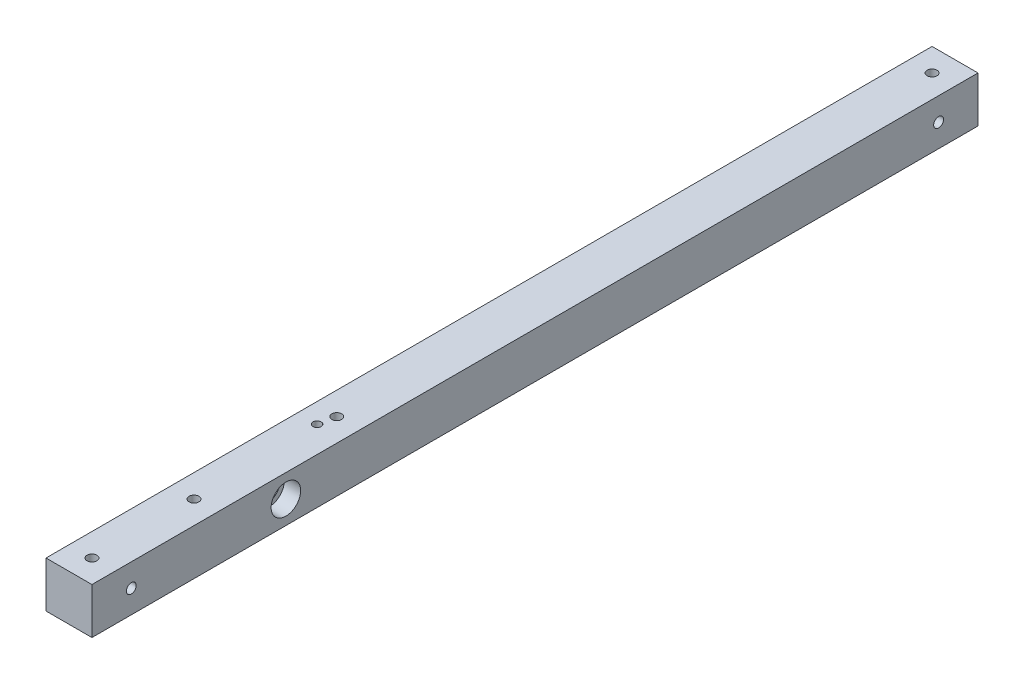
ISO-10303-21;
HEADER;
FILE_DESCRIPTION(('STEP AP214'),'2;1');
FILE_NAME('part.step','',(''),(''),'','','');
FILE_SCHEMA(('AUTOMOTIVE_DESIGN { 1 0 10303 214 1 1 1 1 }'));
ENDSEC;
DATA;
#1=APPLICATION_CONTEXT('core data for automotive mechanical design processes');
#2=APPLICATION_PROTOCOL_DEFINITION('international standard','automotive_design',2000,#1);
#3=PRODUCT_CONTEXT('',#1,'mechanical');
#4=PRODUCT('Part','Part','',(#3));
#5=PRODUCT_RELATED_PRODUCT_CATEGORY('part','',(#4));
#6=PRODUCT_DEFINITION_FORMATION('','',#4);
#7=PRODUCT_DEFINITION_CONTEXT('part definition',#1,'design');
#8=PRODUCT_DEFINITION('design','',#6,#7);
#9=PRODUCT_DEFINITION_SHAPE('','',#8);
#10=(LENGTH_UNIT() NAMED_UNIT(*) SI_UNIT(.MILLI.,.METRE.));
#11=(NAMED_UNIT(*) PLANE_ANGLE_UNIT() SI_UNIT($,.RADIAN.));
#12=(NAMED_UNIT(*) SI_UNIT($,.STERADIAN.) SOLID_ANGLE_UNIT());
#13=UNCERTAINTY_MEASURE_WITH_UNIT(LENGTH_MEASURE(1.E-05),#10,'distance_accuracy_value','');
#14=(GEOMETRIC_REPRESENTATION_CONTEXT(3) GLOBAL_UNCERTAINTY_ASSIGNED_CONTEXT((#13)) GLOBAL_UNIT_ASSIGNED_CONTEXT((#10,
#11,#12)) REPRESENTATION_CONTEXT('',''));
#15=CARTESIAN_POINT('',(0.,0.,0.));
#16=DIRECTION('',(0.,0.,1.));
#17=DIRECTION('',(1.,0.,0.));
#18=AXIS2_PLACEMENT_3D('',#15,#16,#17);
#19=CARTESIAN_POINT('',(14.,0.,246.));
#20=DIRECTION('',(-1.,0.,0.));
#21=DIRECTION('',(0.,0.,1.));
#22=AXIS2_PLACEMENT_3D('',#19,#20,#21);
#23=CYLINDRICAL_SURFACE('',#22,3.00000000000005);
#24=CARTESIAN_POINT('',(14.,0.,246.));
#25=DIRECTION('',(-1.,0.,0.));
#26=DIRECTION('',(0.,0.,1.));
#27=AXIS2_PLACEMENT_3D('',#24,#25,#26);
#28=CIRCLE('',#27,3.00000000000005);
#29=CARTESIAN_POINT('',(14.,0.,249.));
#30=VERTEX_POINT('',#29);
#31=EDGE_CURVE('E131',#30,#30,#28,.T.);
#32=ORIENTED_EDGE('',*,*,#31,.F.);
#33=EDGE_LOOP('',(#32));
#34=FACE_BOUND('',#33,.T.);
#35=CARTESIAN_POINT('',(-7.,0.,246.));
#36=DIRECTION('',(-1.,0.,0.));
#37=DIRECTION('',(0.,0.,1.));
#38=AXIS2_PLACEMENT_3D('',#35,#36,#37);
#39=CIRCLE('',#38,3.00000000000005);
#40=CARTESIAN_POINT('',(-7.,0.,249.));
#41=VERTEX_POINT('',#40);
#42=EDGE_CURVE('E128',#41,#41,#39,.F.);
#43=ORIENTED_EDGE('',*,*,#42,.F.);
#44=EDGE_LOOP('',(#43));
#45=FACE_BOUND('',#44,.T.);
#46=ADVANCED_FACE('F33',(#34,#45),#23,.F.);
#47=CARTESIAN_POINT('',(14.,0.,-246.));
#48=DIRECTION('',(-1.,0.,0.));
#49=DIRECTION('',(0.,0.,1.));
#50=AXIS2_PLACEMENT_3D('',#47,#48,#49);
#51=CYLINDRICAL_SURFACE('',#50,2.99999999999999);
#52=CARTESIAN_POINT('',(14.,0.,-246.));
#53=DIRECTION('',(-1.,0.,0.));
#54=DIRECTION('',(0.,0.,1.));
#55=AXIS2_PLACEMENT_3D('',#52,#53,#54);
#56=CIRCLE('',#55,2.99999999999999);
#57=CARTESIAN_POINT('',(14.,0.,-243.));
#58=VERTEX_POINT('',#57);
#59=EDGE_CURVE('E135',#58,#58,#56,.T.);
#60=ORIENTED_EDGE('',*,*,#59,.F.);
#61=EDGE_LOOP('',(#60));
#62=FACE_BOUND('',#61,.T.);
#63=CARTESIAN_POINT('',(-7.,0.,-246.));
#64=DIRECTION('',(-1.,0.,0.));
#65=DIRECTION('',(0.,0.,1.));
#66=AXIS2_PLACEMENT_3D('',#63,#64,#65);
#67=CIRCLE('',#66,2.99999999999999);
#68=CARTESIAN_POINT('',(-7.,0.,-243.));
#69=VERTEX_POINT('',#68);
#70=EDGE_CURVE('E126',#69,#69,#67,.F.);
#71=ORIENTED_EDGE('',*,*,#70,.F.);
#72=EDGE_LOOP('',(#71));
#73=FACE_BOUND('',#72,.T.);
#74=ADVANCED_FACE('F192',(#62,#73),#51,.F.);
#75=CARTESIAN_POINT('',(-14.,0.,151.8));
#76=DIRECTION('',(1.,0.,0.));
#77=DIRECTION('',(0.,0.,-1.));
#78=AXIS2_PLACEMENT_3D('',#75,#76,#77);
#79=CYLINDRICAL_SURFACE('',#78,5.99999999999999);
#80=CARTESIAN_POINT('',(-14.,0.,151.8));
#81=DIRECTION('',(1.,0.,0.));
#82=DIRECTION('',(0.,0.,-1.));
#83=AXIS2_PLACEMENT_3D('',#80,#81,#82);
#84=CIRCLE('',#83,5.99999999999999);
#85=CARTESIAN_POINT('',(-14.,0.,145.8));
#86=VERTEX_POINT('',#85);
#87=EDGE_CURVE('E124',#86,#86,#84,.T.);
#88=ORIENTED_EDGE('',*,*,#87,.F.);
#89=EDGE_LOOP('',(#88));
#90=FACE_BOUND('',#89,.T.);
#91=CARTESIAN_POINT('',(4.,0.,151.8));
#92=DIRECTION('',(1.,0.,0.));
#93=DIRECTION('',(0.,0.,-1.));
#94=AXIS2_PLACEMENT_3D('',#91,#92,#93);
#95=CIRCLE('',#94,5.99999999999999);
#96=CARTESIAN_POINT('',(4.,0.,145.8));
#97=VERTEX_POINT('',#96);
#98=EDGE_CURVE('E121',#97,#97,#95,.F.);
#99=ORIENTED_EDGE('',*,*,#98,.F.);
#100=EDGE_LOOP('',(#99));
#101=FACE_BOUND('',#100,.T.);
#102=ADVANCED_FACE('F171',(#90,#101),#79,.F.);
#103=CARTESIAN_POINT('',(0.,14.,256.));
#104=DIRECTION('',(0.,-1.,0.));
#105=DIRECTION('',(0.,0.,-1.));
#106=AXIS2_PLACEMENT_3D('',#103,#104,#105);
#107=CYLINDRICAL_SURFACE('',#106,3.);
#108=CARTESIAN_POINT('',(0.,14.,256.));
#109=DIRECTION('',(0.,-1.,0.));
#110=DIRECTION('',(0.,0.,-1.));
#111=AXIS2_PLACEMENT_3D('',#108,#109,#110);
#112=CIRCLE('',#111,3.);
#113=CARTESIAN_POINT('',(0.,14.,253.));
#114=VERTEX_POINT('',#113);
#115=EDGE_CURVE('E120',#114,#114,#112,.T.);
#116=ORIENTED_EDGE('',*,*,#115,.F.);
#117=EDGE_LOOP('',(#116));
#118=FACE_BOUND('',#117,.T.);
#119=CARTESIAN_POINT('',(0.,-7.,256.));
#120=DIRECTION('',(0.,-1.,0.));
#121=DIRECTION('',(0.,0.,-1.));
#122=AXIS2_PLACEMENT_3D('',#119,#120,#121);
#123=CIRCLE('',#122,3.);
#124=CARTESIAN_POINT('',(0.,-7.,253.));
#125=VERTEX_POINT('',#124);
#126=EDGE_CURVE('E116',#125,#125,#123,.F.);
#127=ORIENTED_EDGE('',*,*,#126,.F.);
#128=EDGE_LOOP('',(#127));
#129=FACE_BOUND('',#128,.T.);
#130=ADVANCED_FACE('F167',(#118,#129),#107,.F.);
#131=CARTESIAN_POINT('',(0.,14.,-256.));
#132=DIRECTION('',(0.,-1.,0.));
#133=DIRECTION('',(0.,0.,-1.));
#134=AXIS2_PLACEMENT_3D('',#131,#132,#133);
#135=CYLINDRICAL_SURFACE('',#134,3.);
#136=CARTESIAN_POINT('',(0.,14.,-256.));
#137=DIRECTION('',(0.,-1.,0.));
#138=DIRECTION('',(0.,0.,-1.));
#139=AXIS2_PLACEMENT_3D('',#136,#137,#138);
#140=CIRCLE('',#139,3.);
#141=CARTESIAN_POINT('',(0.,14.,-259.));
#142=VERTEX_POINT('',#141);
#143=EDGE_CURVE('E107',#142,#142,#140,.T.);
#144=ORIENTED_EDGE('',*,*,#143,.F.);
#145=EDGE_LOOP('',(#144));
#146=FACE_BOUND('',#145,.T.);
#147=CARTESIAN_POINT('',(0.,-7.,-256.));
#148=DIRECTION('',(0.,-1.,0.));
#149=DIRECTION('',(0.,0.,-1.));
#150=AXIS2_PLACEMENT_3D('',#147,#148,#149);
#151=CIRCLE('',#150,3.);
#152=CARTESIAN_POINT('',(0.,-7.,-259.));
#153=VERTEX_POINT('',#152);
#154=EDGE_CURVE('E113',#153,#153,#151,.F.);
#155=ORIENTED_EDGE('',*,*,#154,.F.);
#156=EDGE_LOOP('',(#155));
#157=FACE_BOUND('',#156,.T.);
#158=ADVANCED_FACE('F170',(#146,#157),#135,.F.);
#159=CARTESIAN_POINT('',(14.,-14.,270.));
#160=DIRECTION('',(-1.,0.,0.));
#161=DIRECTION('',(0.,0.,1.));
#162=AXIS2_PLACEMENT_3D('',#159,#160,#161);
#163=PLANE('',#162);
#164=ORIENTED_EDGE('',*,*,#59,.T.);
#165=EDGE_LOOP('',(#164));
#166=FACE_BOUND('',#165,.T.);
#167=ORIENTED_EDGE('',*,*,#31,.T.);
#168=EDGE_LOOP('',(#167));
#169=FACE_BOUND('',#168,.T.);
#170=CARTESIAN_POINT('',(14.,0.,151.8));
#171=DIRECTION('',(1.,0.,0.));
#172=DIRECTION('',(0.,0.,-1.));
#173=AXIS2_PLACEMENT_3D('',#170,#171,#172);
#174=CIRCLE('',#173,8.99999999999998);
#175=CARTESIAN_POINT('',(14.,0.,142.8));
#176=VERTEX_POINT('',#175);
#177=EDGE_CURVE('E140',#176,#176,#174,.T.);
#178=ORIENTED_EDGE('',*,*,#177,.F.);
#179=EDGE_LOOP('',(#178));
#180=FACE_BOUND('',#179,.T.);
#181=DIRECTION('',(0.,1.,0.));
#182=VECTOR('',#181,1.);
#183=CARTESIAN_POINT('',(14.,-14.,-270.));
#184=LINE('',#183,#182);
#185=CARTESIAN_POINT('',(14.,-14.,-270.));
#186=VERTEX_POINT('',#185);
#187=CARTESIAN_POINT('',(14.,14.,-270.));
#188=VERTEX_POINT('',#187);
#189=EDGE_CURVE('E104',#186,#188,#184,.T.);
#190=ORIENTED_EDGE('',*,*,#189,.T.);
#191=DIRECTION('',(0.,0.,-1.));
#192=VECTOR('',#191,1.);
#193=CARTESIAN_POINT('',(14.,14.,270.));
#194=LINE('',#193,#192);
#195=CARTESIAN_POINT('',(14.,14.,270.));
#196=VERTEX_POINT('',#195);
#197=EDGE_CURVE('E11',#196,#188,#194,.T.);
#198=ORIENTED_EDGE('',*,*,#197,.F.);
#199=DIRECTION('',(0.,1.,0.));
#200=VECTOR('',#199,1.);
#201=CARTESIAN_POINT('',(14.,-14.,270.));
#202=LINE('',#201,#200);
#203=CARTESIAN_POINT('',(14.,-14.,270.));
#204=VERTEX_POINT('',#203);
#205=EDGE_CURVE('E91',#204,#196,#202,.T.);
#206=ORIENTED_EDGE('',*,*,#205,.F.);
#207=DIRECTION('',(0.,0.,-1.));
#208=VECTOR('',#207,1.);
#209=CARTESIAN_POINT('',(14.,-14.,270.));
#210=LINE('',#209,#208);
#211=EDGE_CURVE('E100',#204,#186,#210,.T.);
#212=ORIENTED_EDGE('',*,*,#211,.T.);
#213=EDGE_LOOP('',(#190,#198,#206,#212));
#214=FACE_BOUND('',#213,.T.);
#215=ADVANCED_FACE('F35',(#166,#169,#180,#214),#163,.F.);
#216=CARTESIAN_POINT('',(-14.,14.,270.));
#217=DIRECTION('',(0.,-1.,0.));
#218=DIRECTION('',(0.,0.,-1.));
#219=AXIS2_PLACEMENT_3D('',#216,#217,#218);
#220=PLANE('',#219);
#221=CARTESIAN_POINT('',(-2.,14.,116.8));
#222=DIRECTION('',(0.,1.,0.));
#223=DIRECTION('',(0.,0.,1.));
#224=AXIS2_PLACEMENT_3D('',#221,#222,#223);
#225=CIRCLE('',#224,2.5);
#226=CARTESIAN_POINT('',(-2.,14.,119.3));
#227=VERTEX_POINT('',#226);
#228=EDGE_CURVE('E252',#227,#227,#225,.T.);
#229=ORIENTED_EDGE('',*,*,#228,.F.);
#230=EDGE_LOOP('',(#229));
#231=FACE_BOUND('',#230,.T.);
#232=CARTESIAN_POINT('',(0.,14.,106.8));
#233=DIRECTION('',(0.,1.,0.));
#234=DIRECTION('',(0.,0.,1.));
#235=AXIS2_PLACEMENT_3D('',#232,#233,#234);
#236=CIRCLE('',#235,3.);
#237=CARTESIAN_POINT('',(0.,14.,109.8));
#238=VERTEX_POINT('',#237);
#239=EDGE_CURVE('E256',#238,#238,#236,.T.);
#240=ORIENTED_EDGE('',*,*,#239,.F.);
#241=EDGE_LOOP('',(#240));
#242=FACE_BOUND('',#241,.T.);
#243=CARTESIAN_POINT('',(0.,14.,193.8));
#244=DIRECTION('',(0.,1.,0.));
#245=DIRECTION('',(0.,0.,1.));
#246=AXIS2_PLACEMENT_3D('',#243,#244,#245);
#247=CIRCLE('',#246,3.);
#248=CARTESIAN_POINT('',(0.,14.,196.8));
#249=VERTEX_POINT('',#248);
#250=EDGE_CURVE('E260',#249,#249,#247,.T.);
#251=ORIENTED_EDGE('',*,*,#250,.F.);
#252=EDGE_LOOP('',(#251));
#253=FACE_BOUND('',#252,.T.);
#254=ORIENTED_EDGE('',*,*,#143,.T.);
#255=EDGE_LOOP('',(#254));
#256=FACE_BOUND('',#255,.T.);
#257=ORIENTED_EDGE('',*,*,#115,.T.);
#258=EDGE_LOOP('',(#257));
#259=FACE_BOUND('',#258,.T.);
#260=DIRECTION('',(-1.,0.,0.));
#261=VECTOR('',#260,1.);
#262=CARTESIAN_POINT('',(-14.,14.,-270.));
#263=LINE('',#262,#261);
#264=CARTESIAN_POINT('',(-14.,14.,-270.));
#265=VERTEX_POINT('',#264);
#266=EDGE_CURVE('E95',#188,#265,#263,.T.);
#267=ORIENTED_EDGE('',*,*,#266,.T.);
#268=DIRECTION('',(0.,0.,-1.));
#269=VECTOR('',#268,1.);
#270=CARTESIAN_POINT('',(-14.,14.,270.));
#271=LINE('',#270,#269);
#272=CARTESIAN_POINT('',(-14.,14.,270.));
#273=VERTEX_POINT('',#272);
#274=EDGE_CURVE('E47',#273,#265,#271,.T.);
#275=ORIENTED_EDGE('',*,*,#274,.F.);
#276=DIRECTION('',(-1.,0.,0.));
#277=VECTOR('',#276,1.);
#278=CARTESIAN_POINT('',(-14.,14.,270.));
#279=LINE('',#278,#277);
#280=EDGE_CURVE('E86',#196,#273,#279,.T.);
#281=ORIENTED_EDGE('',*,*,#280,.F.);
#282=ORIENTED_EDGE('',*,*,#197,.T.);
#283=EDGE_LOOP('',(#267,#275,#281,#282));
#284=FACE_BOUND('',#283,.T.);
#285=ADVANCED_FACE('F94',(#231,#242,#253,#256,#259,#284),#220,.F.);
#286=CARTESIAN_POINT('',(-14.,-14.,270.));
#287=DIRECTION('',(1.,0.,0.));
#288=DIRECTION('',(0.,0.,-1.));
#289=AXIS2_PLACEMENT_3D('',#286,#287,#288);
#290=PLANE('',#289);
#291=CARTESIAN_POINT('',(-14.,0.,116.8));
#292=DIRECTION('',(-1.,0.,0.));
#293=DIRECTION('',(0.,0.,1.));
#294=AXIS2_PLACEMENT_3D('',#291,#292,#293);
#295=CIRCLE('',#294,6.);
#296=CARTESIAN_POINT('',(-14.,0.,122.8));
#297=VERTEX_POINT('',#296);
#298=EDGE_CURVE('E268',#297,#297,#295,.T.);
#299=ORIENTED_EDGE('',*,*,#298,.F.);
#300=EDGE_LOOP('',(#299));
#301=FACE_BOUND('',#300,.T.);
#302=CARTESIAN_POINT('',(-14.,0.,-246.));
#303=DIRECTION('',(-1.,0.,0.));
#304=DIRECTION('',(0.,0.,1.));
#305=AXIS2_PLACEMENT_3D('',#302,#303,#304);
#306=CIRCLE('',#305,4.99999999999999);
#307=CARTESIAN_POINT('',(-14.,0.,-241.));
#308=VERTEX_POINT('',#307);
#309=EDGE_CURVE('E274',#308,#308,#306,.T.);
#310=ORIENTED_EDGE('',*,*,#309,.F.);
#311=EDGE_LOOP('',(#310));
#312=FACE_BOUND('',#311,.T.);
#313=CARTESIAN_POINT('',(-14.,0.,246.));
#314=DIRECTION('',(-1.,0.,0.));
#315=DIRECTION('',(0.,0.,1.));
#316=AXIS2_PLACEMENT_3D('',#313,#314,#315);
#317=CIRCLE('',#316,5.00000000000002);
#318=CARTESIAN_POINT('',(-14.,0.,251.));
#319=VERTEX_POINT('',#318);
#320=EDGE_CURVE('E279',#319,#319,#317,.T.);
#321=ORIENTED_EDGE('',*,*,#320,.F.);
#322=EDGE_LOOP('',(#321));
#323=FACE_BOUND('',#322,.T.);
#324=ORIENTED_EDGE('',*,*,#87,.T.);
#325=EDGE_LOOP('',(#324));
#326=FACE_BOUND('',#325,.T.);
#327=DIRECTION('',(0.,-1.,0.));
#328=VECTOR('',#327,1.);
#329=CARTESIAN_POINT('',(-14.,-14.,-270.));
#330=LINE('',#329,#328);
#331=CARTESIAN_POINT('',(-14.,-14.,-270.));
#332=VERTEX_POINT('',#331);
#333=EDGE_CURVE('E73',#265,#332,#330,.T.);
#334=ORIENTED_EDGE('',*,*,#333,.T.);
#335=DIRECTION('',(0.,0.,-1.));
#336=VECTOR('',#335,1.);
#337=CARTESIAN_POINT('',(-14.,-14.,270.));
#338=LINE('',#337,#336);
#339=CARTESIAN_POINT('',(-14.,-14.,270.));
#340=VERTEX_POINT('',#339);
#341=EDGE_CURVE('E96',#340,#332,#338,.T.);
#342=ORIENTED_EDGE('',*,*,#341,.F.);
#343=DIRECTION('',(0.,-1.,0.));
#344=VECTOR('',#343,1.);
#345=CARTESIAN_POINT('',(-14.,-14.,270.));
#346=LINE('',#345,#344);
#347=EDGE_CURVE('E89',#273,#340,#346,.T.);
#348=ORIENTED_EDGE('',*,*,#347,.F.);
#349=ORIENTED_EDGE('',*,*,#274,.T.);
#350=EDGE_LOOP('',(#334,#342,#348,#349));
#351=FACE_BOUND('',#350,.T.);
#352=ADVANCED_FACE('F98',(#301,#312,#323,#326,#351),#290,.F.);
#353=CARTESIAN_POINT('',(-14.,-14.,270.));
#354=DIRECTION('',(0.,1.,0.));
#355=DIRECTION('',(0.,0.,1.));
#356=AXIS2_PLACEMENT_3D('',#353,#354,#355);
#357=PLANE('',#356);
#358=CARTESIAN_POINT('',(0.,-14.,-256.));
#359=DIRECTION('',(0.,-1.,0.));
#360=DIRECTION('',(0.,0.,-1.));
#361=AXIS2_PLACEMENT_3D('',#358,#359,#360);
#362=CIRCLE('',#361,5.00000000000001);
#363=CARTESIAN_POINT('',(0.,-14.,-261.));
#364=VERTEX_POINT('',#363);
#365=EDGE_CURVE('E153',#364,#364,#362,.T.);
#366=ORIENTED_EDGE('',*,*,#365,.F.);
#367=EDGE_LOOP('',(#366));
#368=FACE_BOUND('',#367,.T.);
#369=CARTESIAN_POINT('',(0.,-14.,256.));
#370=DIRECTION('',(0.,-1.,0.));
#371=DIRECTION('',(0.,0.,-1.));
#372=AXIS2_PLACEMENT_3D('',#369,#370,#371);
#373=CIRCLE('',#372,5.00000000000001);
#374=CARTESIAN_POINT('',(0.,-14.,251.));
#375=VERTEX_POINT('',#374);
#376=EDGE_CURVE('E150',#375,#375,#373,.T.);
#377=ORIENTED_EDGE('',*,*,#376,.F.);
#378=EDGE_LOOP('',(#377));
#379=FACE_BOUND('',#378,.T.);
#380=DIRECTION('',(1.,0.,0.));
#381=VECTOR('',#380,1.);
#382=CARTESIAN_POINT('',(-14.,-14.,-270.));
#383=LINE('',#382,#381);
#384=EDGE_CURVE('E79',#332,#186,#383,.T.);
#385=ORIENTED_EDGE('',*,*,#384,.T.);
#386=ORIENTED_EDGE('',*,*,#211,.F.);
#387=DIRECTION('',(1.,0.,0.));
#388=VECTOR('',#387,1.);
#389=CARTESIAN_POINT('',(-14.,-14.,270.));
#390=LINE('',#389,#388);
#391=EDGE_CURVE('E56',#340,#204,#390,.T.);
#392=ORIENTED_EDGE('',*,*,#391,.F.);
#393=ORIENTED_EDGE('',*,*,#341,.T.);
#394=EDGE_LOOP('',(#385,#386,#392,#393));
#395=FACE_BOUND('',#394,.T.);
#396=ADVANCED_FACE('F236',(#368,#379,#395),#357,.F.);
#397=CARTESIAN_POINT('',(0.,0.,270.));
#398=DIRECTION('',(0.,0.,-1.));
#399=DIRECTION('',(-1.,0.,0.));
#400=AXIS2_PLACEMENT_3D('',#397,#398,#399);
#401=PLANE('',#400);
#402=ORIENTED_EDGE('',*,*,#205,.T.);
#403=ORIENTED_EDGE('',*,*,#280,.T.);
#404=ORIENTED_EDGE('',*,*,#347,.T.);
#405=ORIENTED_EDGE('',*,*,#391,.T.);
#406=EDGE_LOOP('',(#402,#403,#404,#405));
#407=FACE_BOUND('',#406,.T.);
#408=ADVANCED_FACE('F87',(#407),#401,.F.);
#409=CARTESIAN_POINT('',(0.,0.,-270.));
#410=DIRECTION('',(0.,0.,-1.));
#411=DIRECTION('',(-1.,0.,0.));
#412=AXIS2_PLACEMENT_3D('',#409,#410,#411);
#413=PLANE('',#412);
#414=ORIENTED_EDGE('',*,*,#189,.F.);
#415=ORIENTED_EDGE('',*,*,#384,.F.);
#416=ORIENTED_EDGE('',*,*,#333,.F.);
#417=ORIENTED_EDGE('',*,*,#266,.F.);
#418=EDGE_LOOP('',(#414,#415,#416,#417));
#419=FACE_BOUND('',#418,.T.);
#420=ADVANCED_FACE('F215',(#419),#413,.T.);
#421=CARTESIAN_POINT('',(0.,-7.,-256.));
#422=DIRECTION('',(0.,-1.,0.));
#423=DIRECTION('',(0.,0.,-1.));
#424=AXIS2_PLACEMENT_3D('',#421,#422,#423);
#425=PLANE('',#424);
#426=CARTESIAN_POINT('',(0.,-7.,-256.));
#427=DIRECTION('',(0.,-1.,0.));
#428=DIRECTION('',(0.,0.,-1.));
#429=AXIS2_PLACEMENT_3D('',#426,#427,#428);
#430=CIRCLE('',#429,5.00000000000001);
#431=CARTESIAN_POINT('',(0.,-7.,-261.));
#432=VERTEX_POINT('',#431);
#433=EDGE_CURVE('E117',#432,#432,#430,.T.);
#434=ORIENTED_EDGE('',*,*,#433,.T.);
#435=EDGE_LOOP('',(#434));
#436=FACE_BOUND('',#435,.T.);
#437=ORIENTED_EDGE('',*,*,#154,.T.);
#438=EDGE_LOOP('',(#437));
#439=FACE_BOUND('',#438,.T.);
#440=ADVANCED_FACE('F188',(#436,#439),#425,.T.);
#441=CARTESIAN_POINT('',(0.,-7.,-256.));
#442=DIRECTION('',(0.,-1.,0.));
#443=DIRECTION('',(0.,0.,-1.));
#444=AXIS2_PLACEMENT_3D('',#441,#442,#443);
#445=CYLINDRICAL_SURFACE('',#444,5.00000000000001);
#446=ORIENTED_EDGE('',*,*,#433,.F.);
#447=EDGE_LOOP('',(#446));
#448=FACE_BOUND('',#447,.T.);
#449=ORIENTED_EDGE('',*,*,#365,.T.);
#450=EDGE_LOOP('',(#449));
#451=FACE_BOUND('',#450,.T.);
#452=ADVANCED_FACE('F178',(#448,#451),#445,.F.);
#453=CARTESIAN_POINT('',(0.,-7.,256.));
#454=DIRECTION('',(0.,-1.,0.));
#455=DIRECTION('',(0.,0.,-1.));
#456=AXIS2_PLACEMENT_3D('',#453,#454,#455);
#457=PLANE('',#456);
#458=CARTESIAN_POINT('',(0.,-7.,256.));
#459=DIRECTION('',(0.,-1.,0.));
#460=DIRECTION('',(0.,0.,-1.));
#461=AXIS2_PLACEMENT_3D('',#458,#459,#460);
#462=CIRCLE('',#461,5.00000000000001);
#463=CARTESIAN_POINT('',(0.,-7.,251.));
#464=VERTEX_POINT('',#463);
#465=EDGE_CURVE('E156',#464,#464,#462,.T.);
#466=ORIENTED_EDGE('',*,*,#465,.T.);
#467=EDGE_LOOP('',(#466));
#468=FACE_BOUND('',#467,.T.);
#469=ORIENTED_EDGE('',*,*,#126,.T.);
#470=EDGE_LOOP('',(#469));
#471=FACE_BOUND('',#470,.T.);
#472=ADVANCED_FACE('F175',(#468,#471),#457,.T.);
#473=CARTESIAN_POINT('',(0.,-7.,256.));
#474=DIRECTION('',(0.,-1.,0.));
#475=DIRECTION('',(0.,0.,-1.));
#476=AXIS2_PLACEMENT_3D('',#473,#474,#475);
#477=CYLINDRICAL_SURFACE('',#476,5.00000000000001);
#478=ORIENTED_EDGE('',*,*,#465,.F.);
#479=EDGE_LOOP('',(#478));
#480=FACE_BOUND('',#479,.T.);
#481=ORIENTED_EDGE('',*,*,#376,.T.);
#482=EDGE_LOOP('',(#481));
#483=FACE_BOUND('',#482,.T.);
#484=ADVANCED_FACE('F177',(#480,#483),#477,.F.);
#485=CARTESIAN_POINT('',(4.,0.,151.8));
#486=DIRECTION('',(1.,0.,0.));
#487=DIRECTION('',(0.,0.,-1.));
#488=AXIS2_PLACEMENT_3D('',#485,#486,#487);
#489=PLANE('',#488);
#490=CARTESIAN_POINT('',(4.,0.,151.8));
#491=DIRECTION('',(1.,0.,0.));
#492=DIRECTION('',(0.,0.,-1.));
#493=AXIS2_PLACEMENT_3D('',#490,#491,#492);
#494=CIRCLE('',#493,8.99999999999998);
#495=CARTESIAN_POINT('',(4.,0.,142.8));
#496=VERTEX_POINT('',#495);
#497=EDGE_CURVE('E125',#496,#496,#494,.T.);
#498=ORIENTED_EDGE('',*,*,#497,.T.);
#499=EDGE_LOOP('',(#498));
#500=FACE_BOUND('',#499,.T.);
#501=ORIENTED_EDGE('',*,*,#98,.T.);
#502=EDGE_LOOP('',(#501));
#503=FACE_BOUND('',#502,.T.);
#504=ADVANCED_FACE('F185',(#500,#503),#489,.T.);
#505=CARTESIAN_POINT('',(4.,0.,151.8));
#506=DIRECTION('',(1.,0.,0.));
#507=DIRECTION('',(0.,0.,-1.));
#508=AXIS2_PLACEMENT_3D('',#505,#506,#507);
#509=CYLINDRICAL_SURFACE('',#508,8.99999999999998);
#510=ORIENTED_EDGE('',*,*,#497,.F.);
#511=EDGE_LOOP('',(#510));
#512=FACE_BOUND('',#511,.T.);
#513=ORIENTED_EDGE('',*,*,#177,.T.);
#514=EDGE_LOOP('',(#513));
#515=FACE_BOUND('',#514,.T.);
#516=ADVANCED_FACE('F205',(#512,#515),#509,.F.);
#517=CARTESIAN_POINT('',(-7.,0.,-246.));
#518=DIRECTION('',(-1.,0.,0.));
#519=DIRECTION('',(0.,0.,1.));
#520=AXIS2_PLACEMENT_3D('',#517,#518,#519);
#521=PLANE('',#520);
#522=CARTESIAN_POINT('',(-7.,0.,-246.));
#523=DIRECTION('',(-1.,0.,0.));
#524=DIRECTION('',(0.,0.,1.));
#525=AXIS2_PLACEMENT_3D('',#522,#523,#524);
#526=CIRCLE('',#525,4.99999999999999);
#527=CARTESIAN_POINT('',(-7.,0.,-241.));
#528=VERTEX_POINT('',#527);
#529=EDGE_CURVE('E129',#528,#528,#526,.T.);
#530=ORIENTED_EDGE('',*,*,#529,.T.);
#531=EDGE_LOOP('',(#530));
#532=FACE_BOUND('',#531,.T.);
#533=ORIENTED_EDGE('',*,*,#70,.T.);
#534=EDGE_LOOP('',(#533));
#535=FACE_BOUND('',#534,.T.);
#536=ADVANCED_FACE('F209',(#532,#535),#521,.T.);
#537=CARTESIAN_POINT('',(-7.,0.,-246.));
#538=DIRECTION('',(-1.,0.,0.));
#539=DIRECTION('',(0.,0.,1.));
#540=AXIS2_PLACEMENT_3D('',#537,#538,#539);
#541=CYLINDRICAL_SURFACE('',#540,4.99999999999999);
#542=ORIENTED_EDGE('',*,*,#529,.F.);
#543=EDGE_LOOP('',(#542));
#544=FACE_BOUND('',#543,.T.);
#545=ORIENTED_EDGE('',*,*,#309,.T.);
#546=EDGE_LOOP('',(#545));
#547=FACE_BOUND('',#546,.T.);
#548=ADVANCED_FACE('F327',(#544,#547),#541,.F.);
#549=CARTESIAN_POINT('',(-7.,0.,246.));
#550=DIRECTION('',(-1.,0.,0.));
#551=DIRECTION('',(0.,0.,1.));
#552=AXIS2_PLACEMENT_3D('',#549,#550,#551);
#553=PLANE('',#552);
#554=CARTESIAN_POINT('',(-7.,0.,246.));
#555=DIRECTION('',(-1.,0.,0.));
#556=DIRECTION('',(0.,0.,1.));
#557=AXIS2_PLACEMENT_3D('',#554,#555,#556);
#558=CIRCLE('',#557,5.00000000000002);
#559=CARTESIAN_POINT('',(-7.,0.,251.));
#560=VERTEX_POINT('',#559);
#561=EDGE_CURVE('E277',#560,#560,#558,.T.);
#562=ORIENTED_EDGE('',*,*,#561,.T.);
#563=EDGE_LOOP('',(#562));
#564=FACE_BOUND('',#563,.T.);
#565=ORIENTED_EDGE('',*,*,#42,.T.);
#566=EDGE_LOOP('',(#565));
#567=FACE_BOUND('',#566,.T.);
#568=ADVANCED_FACE('F331',(#564,#567),#553,.T.);
#569=CARTESIAN_POINT('',(-7.,0.,246.));
#570=DIRECTION('',(-1.,0.,0.));
#571=DIRECTION('',(0.,0.,1.));
#572=AXIS2_PLACEMENT_3D('',#569,#570,#571);
#573=CYLINDRICAL_SURFACE('',#572,5.00000000000002);
#574=ORIENTED_EDGE('',*,*,#561,.F.);
#575=EDGE_LOOP('',(#574));
#576=FACE_BOUND('',#575,.T.);
#577=ORIENTED_EDGE('',*,*,#320,.T.);
#578=EDGE_LOOP('',(#577));
#579=FACE_BOUND('',#578,.T.);
#580=ADVANCED_FACE('F323',(#576,#579),#573,.F.);
#581=CARTESIAN_POINT('',(0.,4.,193.8));
#582=DIRECTION('',(0.,1.,0.));
#583=DIRECTION('',(0.,0.,1.));
#584=AXIS2_PLACEMENT_3D('',#581,#582,#583);
#585=CYLINDRICAL_SURFACE('',#584,3.);
#586=CARTESIAN_POINT('',(0.,4.,193.8));
#587=DIRECTION('',(0.,1.,0.));
#588=DIRECTION('',(0.,0.,1.));
#589=AXIS2_PLACEMENT_3D('',#586,#587,#588);
#590=CIRCLE('',#589,3.);
#591=CARTESIAN_POINT('',(0.,4.,196.8));
#592=VERTEX_POINT('',#591);
#593=EDGE_CURVE('E262',#592,#592,#590,.T.);
#594=ORIENTED_EDGE('',*,*,#593,.F.);
#595=EDGE_LOOP('',(#594));
#596=FACE_BOUND('',#595,.T.);
#597=ORIENTED_EDGE('',*,*,#250,.T.);
#598=EDGE_LOOP('',(#597));
#599=FACE_BOUND('',#598,.T.);
#600=ADVANCED_FACE('F319',(#596,#599),#585,.F.);
#601=CARTESIAN_POINT('',(0.,4.,193.8));
#602=DIRECTION('',(0.,1.,0.));
#603=DIRECTION('',(0.,0.,1.));
#604=AXIS2_PLACEMENT_3D('',#601,#602,#603);
#605=PLANE('',#604);
#606=ORIENTED_EDGE('',*,*,#593,.T.);
#607=EDGE_LOOP('',(#606));
#608=FACE_BOUND('',#607,.T.);
#609=ADVANCED_FACE('F315',(#608),#605,.T.);
#610=CARTESIAN_POINT('',(0.,4.,106.8));
#611=DIRECTION('',(0.,1.,0.));
#612=DIRECTION('',(0.,0.,1.));
#613=AXIS2_PLACEMENT_3D('',#610,#611,#612);
#614=CYLINDRICAL_SURFACE('',#613,3.);
#615=CARTESIAN_POINT('',(0.,4.,106.8));
#616=DIRECTION('',(0.,1.,0.));
#617=DIRECTION('',(0.,0.,1.));
#618=AXIS2_PLACEMENT_3D('',#615,#616,#617);
#619=CIRCLE('',#618,3.);
#620=CARTESIAN_POINT('',(0.,4.,109.8));
#621=VERTEX_POINT('',#620);
#622=EDGE_CURVE('E281',#621,#621,#619,.T.);
#623=ORIENTED_EDGE('',*,*,#622,.F.);
#624=EDGE_LOOP('',(#623));
#625=FACE_BOUND('',#624,.T.);
#626=ORIENTED_EDGE('',*,*,#239,.T.);
#627=EDGE_LOOP('',(#626));
#628=FACE_BOUND('',#627,.T.);
#629=ADVANCED_FACE('F312',(#625,#628),#614,.F.);
#630=CARTESIAN_POINT('',(0.,4.,106.8));
#631=DIRECTION('',(0.,1.,0.));
#632=DIRECTION('',(0.,0.,1.));
#633=AXIS2_PLACEMENT_3D('',#630,#631,#632);
#634=PLANE('',#633);
#635=ORIENTED_EDGE('',*,*,#622,.T.);
#636=EDGE_LOOP('',(#635));
#637=FACE_BOUND('',#636,.T.);
#638=ADVANCED_FACE('F309',(#637),#634,.T.);
#639=CARTESIAN_POINT('',(6.,0.,116.8));
#640=DIRECTION('',(-1.,0.,0.));
#641=DIRECTION('',(0.,0.,1.));
#642=AXIS2_PLACEMENT_3D('',#639,#640,#641);
#643=CYLINDRICAL_SURFACE('',#642,6.);
#644=CARTESIAN_POINT('',(-2.,5.45435605731786,119.3));
#645=CARTESIAN_POINT('',(-1.9332918168451,5.45435734054166,119.299998500259));
#646=CARTESIAN_POINT('',(-1.86656520783146,5.4555854329,119.297324495389));
#647=CARTESIAN_POINT('',(-1.73361352159701,5.46045125759501,119.286664164856));
#648=CARTESIAN_POINT('',(-1.6673887661049,5.46409042196574,119.278674682102));
#649=CARTESIAN_POINT('',(-1.46994813322944,5.47848490817198,119.246792659316));
#650=CARTESIAN_POINT('',(-1.34016318357051,5.49271671920564,119.214986834082));
#651=CARTESIAN_POINT('',(-1.08884523586874,5.52853615769556,119.131800013376));
#652=CARTESIAN_POINT('',(-0.967280947908389,5.55009376241034,119.080498814386));
#653=CARTESIAN_POINT('',(-0.734489823443009,5.59808356001865,118.960012689347));
#654=CARTESIAN_POINT('',(-0.623260550023205,5.62451459938574,118.890831993765));
#655=CARTESIAN_POINT('',(-0.407346017910578,5.68111508149861,118.731947784437));
#656=CARTESIAN_POINT('',(-0.303384202952536,5.71141131571833,118.641306481491));
#657=CARTESIAN_POINT('',(-0.111600234825528,5.77128595332677,118.444043346367));
#658=CARTESIAN_POINT('',(-0.0237843044888498,5.80086407614999,118.337415381348));
#659=CARTESIAN_POINT('',(0.136899255528641,5.8575107455344,118.105526789055));
#660=CARTESIAN_POINT('',(0.208953307881464,5.88441479600862,117.979658587758));
#661=CARTESIAN_POINT('',(0.330551989217488,5.93113040336417,117.716264044334));
#662=CARTESIAN_POINT('',(0.380106610397422,5.95094510785638,117.578742909642));
#663=CARTESIAN_POINT('',(0.452678930340364,5.98035041998162,117.303536996147));
#664=CARTESIAN_POINT('',(0.476943393233227,5.99041942231786,117.166233152418));
#665=CARTESIAN_POINT('',(0.502275278891982,6.00093657245547,116.889158360704));
#666=CARTESIAN_POINT('',(0.503352110874229,6.00138862268062,116.749388436464));
#667=CARTESIAN_POINT('',(0.482931438970795,5.99290258260449,116.480414439781));
#668=CARTESIAN_POINT('',(0.462803799173119,5.98453429295768,116.351085022787));
#669=CARTESIAN_POINT('',(0.402893794499094,5.96013033502179,116.097834212135));
#670=CARTESIAN_POINT('',(0.36310998067885,5.94409410149732,115.97391321789));
#671=CARTESIAN_POINT('',(0.264543918272478,5.90559704827471,115.732723763846));
#672=CARTESIAN_POINT('',(0.20548107427577,5.88304194251415,115.615585645851));
#673=CARTESIAN_POINT('',(0.0703084865819098,5.83371427980367,115.392576465435));
#674=CARTESIAN_POINT('',(-0.00580728169784321,5.80694023334948,115.286709404484));
#675=CARTESIAN_POINT('',(-0.179164840800789,5.74963397551513,115.081318176587));
#676=CARTESIAN_POINT('',(-0.277517582543029,5.71896988702082,114.982767125377));
#677=CARTESIAN_POINT('',(-0.489422881428126,5.65875721372882,114.803137170135));
#678=CARTESIAN_POINT('',(-0.602981276635655,5.62920906299902,114.722065008317));
#679=CARTESIAN_POINT('',(-0.846790073279715,5.57363224672088,114.577196215029));
#680=CARTESIAN_POINT('',(-0.977466411305492,5.54775116967603,114.514054933016));
#681=CARTESIAN_POINT('',(-1.24896208976256,5.50419688296718,114.41107135896));
#682=CARTESIAN_POINT('',(-1.38977409648425,5.48651780631503,114.371212407488));
#683=CARTESIAN_POINT('',(-1.66779361786699,5.46282425074792,114.318399496608));
#684=CARTESIAN_POINT('',(-1.80464224452852,5.45612738403682,114.303867707335));
#685=CARTESIAN_POINT('',(-2.07895696481259,5.45320573611839,114.297487389628));
#686=CARTESIAN_POINT('',(-2.21642282838074,5.45697733196185,114.305631013639));
#687=CARTESIAN_POINT('',(-2.4787967708634,5.47386262693795,114.342930448687));
#688=CARTESIAN_POINT('',(-2.60394537357419,5.48636276033852,114.370707623639));
#689=CARTESIAN_POINT('',(-2.84770259299515,5.51851260594277,114.444658828716));
#690=CARTESIAN_POINT('',(-2.96630967366157,5.53816398920152,114.490837158938));
#691=CARTESIAN_POINT('',(-3.19923062071278,5.58341595714178,114.602449583896));
#692=CARTESIAN_POINT('',(-3.31314994921936,5.60923324404617,114.668616333876));
#693=CARTESIAN_POINT('',(-3.52881610499933,5.66360007481535,114.817598431228));
#694=CARTESIAN_POINT('',(-3.63055763340873,5.69215079841133,114.900420984248));
#695=CARTESIAN_POINT('',(-3.82760026976261,5.75157239569102,115.088311088569));
#696=CARTESIAN_POINT('',(-3.92170279988035,5.78244293417775,115.194640677042));
#697=CARTESIAN_POINT('',(-4.09094458397964,5.84086722367756,115.422296974892));
#698=CARTESIAN_POINT('',(-4.1660824482059,5.868420731537,115.543624782389));
#699=CARTESIAN_POINT('',(-4.29517975080845,5.91728503171628,115.798690638397));
#700=CARTESIAN_POINT('',(-4.34908448228482,5.93857966278875,115.932459660738));
#701=CARTESIAN_POINT('',(-4.43323358496281,5.9723634620551,116.208282329676));
#702=CARTESIAN_POINT('',(-4.463492037549,5.98485787035282,116.350330991493));
#703=CARTESIAN_POINT('',(-4.49771625002042,5.9990306959926,116.62796693304));
#704=CARTESIAN_POINT('',(-4.50337199571005,6.0014040908376,116.763311830602));
#705=CARTESIAN_POINT('',(-4.49277372109535,5.99699046946599,117.032973623239));
#706=CARTESIAN_POINT('',(-4.47652354168605,5.99020505911645,117.167290694378));
#707=CARTESIAN_POINT('',(-4.4237878424573,5.9686013201843,117.426172965578));
#708=CARTESIAN_POINT('',(-4.38804059052424,5.95407648620171,117.550915078182));
#709=CARTESIAN_POINT('',(-4.29813155412763,5.91858999492375,117.792584458507));
#710=CARTESIAN_POINT('',(-4.24396627164176,5.8976271149635,117.909510236669));
#711=CARTESIAN_POINT('',(-4.11602075242076,5.85011651583377,118.138049140681));
#712=CARTESIAN_POINT('',(-4.04146467648696,5.823359213724,118.249183352998));
#713=CARTESIAN_POINT('',(-3.87598635518928,5.7674312075248,118.457837314219));
#714=CARTESIAN_POINT('',(-3.78505803416388,5.73825960968077,118.555351985041));
#715=CARTESIAN_POINT('',(-3.58210746992792,5.67829702479814,118.740899722423));
#716=CARTESIAN_POINT('',(-3.46907088797006,5.64753091772369,118.827836076994));
#717=CARTESIAN_POINT('',(-3.22909360799928,5.5899105903639,118.981666075755));
#718=CARTESIAN_POINT('',(-3.10214519133264,5.56305856115974,119.048548515837));
#719=CARTESIAN_POINT('',(-2.83807106664053,5.51685287460304,119.159657442642));
#720=CARTESIAN_POINT('',(-2.70100404485043,5.49745949216625,119.204004372587));
#721=CARTESIAN_POINT('',(-2.49083623093362,5.47594959049765,119.252399253508));
#722=CARTESIAN_POINT('',(-2.42008940204395,5.47004503557757,119.265506033478));
#723=CARTESIAN_POINT('',(-2.27757394358142,5.46095373466209,119.285581309439));
#724=CARTESIAN_POINT('',(-2.20580607207738,5.45776506941947,119.292554140244));
#725=CARTESIAN_POINT('',(-2.08928839436097,5.45490391727669,119.298804796708));
#726=CARTESIAN_POINT('',(-2.0446483243266,5.45435519844583,119.300001003789));
#727=CARTESIAN_POINT('',(-2.,5.45435605731786,119.3));
#728=B_SPLINE_CURVE_WITH_KNOTS('',3,(#644,#645,#646,#647,#648,#649,#650,#651,#652,#653,#654,
#655,#656,#657,#658,#659,#660,#661,#662,#663,#664,#665,#666,#667,#668,#669,#670,#671,#672,#673,
#674,#675,#676,#677,#678,#679,#680,#681,#682,#683,#684,#685,#686,#687,#688,#689,#690,#691,#692,
#693,#694,#695,#696,#697,#698,#699,#700,#701,#702,#703,#704,#705,#706,#707,#708,#709,#710,#711,
#712,#713,#714,#715,#716,#717,#718,#719,#720,#721,#722,#723,#724,#725,#726,#727),.UNSPECIFIED.,
.T.,.F.,(4,2,2,2,2,2,2,2,2,2,2,2,2,2,2,2,2,2,2,2,2,2,2,2,2,2,2,2,2,2,2,2,2,2,2,2,2,2,2,2,2,4),
(0.,0.200084575093044,0.400288095243579,0.801278994956904,1.20064597557678,1.59991854837275,
2.02172149988563,2.44368668047076,2.88395420283104,3.32402600677039,3.74119679083162,
4.15819828963117,4.54982147617441,4.94147353531023,5.33910096407386,5.73686909172223,
6.16267530816224,6.58864548009988,7.0286155846392,7.46827048625635,7.87940023747112,
8.29038772171394,8.6750626926688,9.05982760961556,9.46088720770835,9.86212068725428,
10.2960179260553,10.7299469521823,11.1649867904569,11.5997673642051,12.004157373226,
12.4084764873832,12.7984529720747,13.1885035639884,13.5961819279257,14.0040118923231,
14.4395932095167,14.8754174341574,15.3088871873109,15.5252058174741,15.7413714538654,
15.8752896716763),.UNSPECIFIED.);
#729=CARTESIAN_POINT('',(-2.,5.45435605731786,119.3));
#730=VERTEX_POINT('',#729);
#731=EDGE_CURVE('E37',#730,#730,#728,.T.);
#732=ORIENTED_EDGE('',*,*,#731,.T.);
#733=EDGE_LOOP('',(#732));
#734=FACE_BOUND('',#733,.T.);
#735=CARTESIAN_POINT('',(6.,0.,116.8));
#736=DIRECTION('',(-1.,0.,0.));
#737=DIRECTION('',(0.,0.,1.));
#738=AXIS2_PLACEMENT_3D('',#735,#736,#737);
#739=CIRCLE('',#738,6.);
#740=CARTESIAN_POINT('',(6.,0.,122.8));
#741=VERTEX_POINT('',#740);
#742=EDGE_CURVE('E263',#741,#741,#739,.T.);
#743=ORIENTED_EDGE('',*,*,#742,.F.);
#744=EDGE_LOOP('',(#743));
#745=FACE_BOUND('',#744,.T.);
#746=ORIENTED_EDGE('',*,*,#298,.T.);
#747=EDGE_LOOP('',(#746));
#748=FACE_BOUND('',#747,.T.);
#749=ADVANCED_FACE('F295',(#734,#745,#748),#643,.F.);
#750=CARTESIAN_POINT('',(6.,0.,116.8));
#751=DIRECTION('',(-1.,0.,0.));
#752=DIRECTION('',(0.,0.,1.));
#753=AXIS2_PLACEMENT_3D('',#750,#751,#752);
#754=PLANE('',#753);
#755=ORIENTED_EDGE('',*,*,#742,.T.);
#756=EDGE_LOOP('',(#755));
#757=FACE_BOUND('',#756,.T.);
#758=ADVANCED_FACE('F300',(#757),#754,.T.);
#759=CARTESIAN_POINT('',(-2.,0.,116.8));
#760=DIRECTION('',(0.,1.,0.));
#761=DIRECTION('',(0.,0.,1.));
#762=AXIS2_PLACEMENT_3D('',#759,#760,#761);
#763=CYLINDRICAL_SURFACE('',#762,2.5);
#764=ORIENTED_EDGE('',*,*,#228,.T.);
#765=EDGE_LOOP('',(#764));
#766=FACE_BOUND('',#765,.T.);
#767=ORIENTED_EDGE('',*,*,#731,.F.);
#768=EDGE_LOOP('',(#767));
#769=FACE_BOUND('',#768,.T.);
#770=ADVANCED_FACE('F298',(#766,#769),#763,.F.);
#771=CLOSED_SHELL('',(#46,#74,#102,#130,#158,#215,#285,#352,#396,#408,#420,#440,#452,#472,#484,
#504,#516,#536,#548,#568,#580,#600,#609,#629,#638,#749,#758,#770));
#772=MANIFOLD_SOLID_BREP('B2',#771);
#773=ADVANCED_BREP_SHAPE_REPRESENTATION('',(#18,#772),#14);
#774=SHAPE_DEFINITION_REPRESENTATION(#9,#773);
ENDSEC;
END-ISO-10303-21;
